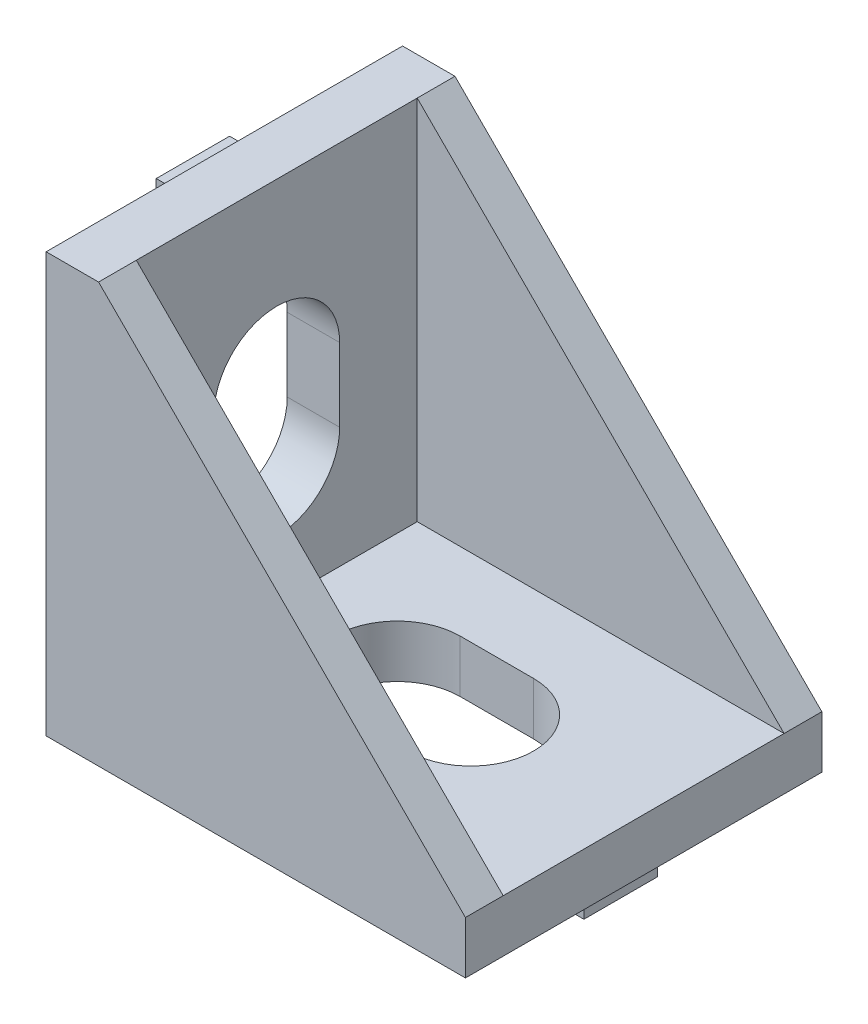
ISO-10303-21;
HEADER;
FILE_DESCRIPTION(('STEP AP214'),'2;1');
FILE_NAME('part.step','',(''),(''),'','','');
FILE_SCHEMA(('AUTOMOTIVE_DESIGN { 1 0 10303 214 1 1 1 1 }'));
ENDSEC;
DATA;
#1=APPLICATION_CONTEXT('core data for automotive mechanical design processes');
#2=APPLICATION_PROTOCOL_DEFINITION('international standard','automotive_design',2000,#1);
#3=PRODUCT_CONTEXT('',#1,'mechanical');
#4=PRODUCT('Part','Part','',(#3));
#5=PRODUCT_RELATED_PRODUCT_CATEGORY('part','',(#4));
#6=PRODUCT_DEFINITION_FORMATION('','',#4);
#7=PRODUCT_DEFINITION_CONTEXT('part definition',#1,'design');
#8=PRODUCT_DEFINITION('design','',#6,#7);
#9=PRODUCT_DEFINITION_SHAPE('','',#8);
#10=(LENGTH_UNIT() NAMED_UNIT(*) SI_UNIT(.MILLI.,.METRE.));
#11=(NAMED_UNIT(*) PLANE_ANGLE_UNIT() SI_UNIT($,.RADIAN.));
#12=(NAMED_UNIT(*) SI_UNIT($,.STERADIAN.) SOLID_ANGLE_UNIT());
#13=UNCERTAINTY_MEASURE_WITH_UNIT(LENGTH_MEASURE(1.E-05),#10,'distance_accuracy_value','');
#14=(GEOMETRIC_REPRESENTATION_CONTEXT(3) GLOBAL_UNCERTAINTY_ASSIGNED_CONTEXT((#13)) GLOBAL_UNIT_ASSIGNED_CONTEXT((#10,
#11,#12)) REPRESENTATION_CONTEXT('',''));
#15=CARTESIAN_POINT('',(0.,0.,0.));
#16=DIRECTION('',(0.,0.,1.));
#17=DIRECTION('',(1.,0.,0.));
#18=AXIS2_PLACEMENT_3D('',#15,#16,#17);
#19=CARTESIAN_POINT('',(0.,0.,8.5));
#20=DIRECTION('',(1.,0.,0.));
#21=DIRECTION('',(0.,0.,-1.));
#22=AXIS2_PLACEMENT_3D('',#19,#20,#21);
#23=PLANE('',#22);
#24=DIRECTION('',(0.,1.,0.));
#25=VECTOR('',#24,1.);
#26=CARTESIAN_POINT('',(0.,2.9,1.75));
#27=LINE('',#26,#25);
#28=CARTESIAN_POINT('',(0.,1.1,1.75));
#29=VERTEX_POINT('',#28);
#30=CARTESIAN_POINT('',(0.,2.9,1.75));
#31=VERTEX_POINT('',#30);
#32=EDGE_CURVE('E272',#29,#31,#27,.T.);
#33=ORIENTED_EDGE('',*,*,#32,.F.);
#34=DIRECTION('',(0.,0.,1.));
#35=VECTOR('',#34,1.);
#36=CARTESIAN_POINT('',(0.,1.1,-1.75));
#37=LINE('',#36,#35);
#38=CARTESIAN_POINT('',(0.,1.1,-1.75));
#39=VERTEX_POINT('',#38);
#40=EDGE_CURVE('E288',#39,#29,#37,.T.);
#41=ORIENTED_EDGE('',*,*,#40,.F.);
#42=DIRECTION('',(0.,-1.,0.));
#43=VECTOR('',#42,1.);
#44=CARTESIAN_POINT('',(0.,2.9,-1.75));
#45=LINE('',#44,#43);
#46=CARTESIAN_POINT('',(0.,2.9,-1.75));
#47=VERTEX_POINT('',#46);
#48=EDGE_CURVE('E301',#47,#39,#45,.T.);
#49=ORIENTED_EDGE('',*,*,#48,.F.);
#50=DIRECTION('',(0.,0.,-1.));
#51=VECTOR('',#50,1.);
#52=CARTESIAN_POINT('',(0.,2.9,-1.75));
#53=LINE('',#52,#51);
#54=EDGE_CURVE('E277',#31,#47,#53,.T.);
#55=ORIENTED_EDGE('',*,*,#54,.F.);
#56=EDGE_LOOP('',(#33,#41,#49,#55));
#57=FACE_BOUND('',#56,.T.);
#58=DIRECTION('',(0.,-1.,0.));
#59=VECTOR('',#58,1.);
#60=CARTESIAN_POINT('',(0.,0.,3.));
#61=LINE('',#60,#59);
#62=CARTESIAN_POINT('',(0.,11.75,3.));
#63=VERTEX_POINT('',#62);
#64=CARTESIAN_POINT('',(0.,8.25,3.));
#65=VERTEX_POINT('',#64);
#66=EDGE_CURVE('E449',#63,#65,#61,.T.);
#67=ORIENTED_EDGE('',*,*,#66,.T.);
#68=CARTESIAN_POINT('',(0.,8.25,0.));
#69=DIRECTION('',(1.,0.,0.));
#70=DIRECTION('',(0.,0.,-1.));
#71=AXIS2_PLACEMENT_3D('',#68,#69,#70);
#72=CIRCLE('',#71,3.);
#73=CARTESIAN_POINT('',(0.,8.25,-3.));
#74=VERTEX_POINT('',#73);
#75=EDGE_CURVE('E453',#65,#74,#72,.T.);
#76=ORIENTED_EDGE('',*,*,#75,.T.);
#77=DIRECTION('',(0.,1.,0.));
#78=VECTOR('',#77,1.);
#79=CARTESIAN_POINT('',(0.,0.,-3.));
#80=LINE('',#79,#78);
#81=CARTESIAN_POINT('',(0.,11.75,-3.));
#82=VERTEX_POINT('',#81);
#83=EDGE_CURVE('E432',#74,#82,#80,.T.);
#84=ORIENTED_EDGE('',*,*,#83,.T.);
#85=CARTESIAN_POINT('',(0.,11.75,0.));
#86=DIRECTION('',(1.,0.,0.));
#87=DIRECTION('',(0.,0.,-1.));
#88=AXIS2_PLACEMENT_3D('',#85,#86,#87);
#89=CIRCLE('',#88,3.);
#90=EDGE_CURVE('E445',#82,#63,#89,.T.);
#91=ORIENTED_EDGE('',*,*,#90,.T.);
#92=EDGE_LOOP('',(#67,#76,#84,#91));
#93=FACE_BOUND('',#92,.T.);
#94=DIRECTION('',(0.,-1.,0.));
#95=VECTOR('',#94,1.);
#96=CARTESIAN_POINT('',(0.,0.,-8.5));
#97=LINE('',#96,#95);
#98=CARTESIAN_POINT('',(0.,20.,-8.5));
#99=VERTEX_POINT('',#98);
#100=CARTESIAN_POINT('',(0.,0.,-8.5));
#101=VERTEX_POINT('',#100);
#102=EDGE_CURVE('E524',#99,#101,#97,.T.);
#103=ORIENTED_EDGE('',*,*,#102,.T.);
#104=DIRECTION('',(0.,0.,-1.));
#105=VECTOR('',#104,1.);
#106=CARTESIAN_POINT('',(0.,0.,8.5));
#107=LINE('',#106,#105);
#108=CARTESIAN_POINT('',(0.,0.,8.5));
#109=VERTEX_POINT('',#108);
#110=EDGE_CURVE('E578',#109,#101,#107,.T.);
#111=ORIENTED_EDGE('',*,*,#110,.F.);
#112=DIRECTION('',(0.,-1.,0.));
#113=VECTOR('',#112,1.);
#114=CARTESIAN_POINT('',(0.,0.,8.5));
#115=LINE('',#114,#113);
#116=CARTESIAN_POINT('',(0.,20.,8.5));
#117=VERTEX_POINT('',#116);
#118=EDGE_CURVE('E527',#117,#109,#115,.T.);
#119=ORIENTED_EDGE('',*,*,#118,.F.);
#120=DIRECTION('',(0.,0.,-1.));
#121=VECTOR('',#120,1.);
#122=CARTESIAN_POINT('',(0.,20.,8.5));
#123=LINE('',#122,#121);
#124=EDGE_CURVE('E544',#117,#99,#123,.T.);
#125=ORIENTED_EDGE('',*,*,#124,.T.);
#126=EDGE_LOOP('',(#103,#111,#119,#125));
#127=FACE_BOUND('',#126,.T.);
#128=DIRECTION('',(0.,-1.,0.));
#129=VECTOR('',#128,1.);
#130=CARTESIAN_POINT('',(0.,17.1,-1.75));
#131=LINE('',#130,#129);
#132=CARTESIAN_POINT('',(0.,18.9,-1.75));
#133=VERTEX_POINT('',#132);
#134=CARTESIAN_POINT('',(0.,17.1,-1.75));
#135=VERTEX_POINT('',#134);
#136=EDGE_CURVE('E270',#133,#135,#131,.T.);
#137=ORIENTED_EDGE('',*,*,#136,.F.);
#138=DIRECTION('',(0.,0.,-1.));
#139=VECTOR('',#138,1.);
#140=CARTESIAN_POINT('',(0.,18.9,-1.75));
#141=LINE('',#140,#139);
#142=CARTESIAN_POINT('',(0.,18.9,1.75));
#143=VERTEX_POINT('',#142);
#144=EDGE_CURVE('E267',#143,#133,#141,.T.);
#145=ORIENTED_EDGE('',*,*,#144,.F.);
#146=DIRECTION('',(0.,1.,0.));
#147=VECTOR('',#146,1.);
#148=CARTESIAN_POINT('',(0.,17.1,1.75));
#149=LINE('',#148,#147);
#150=CARTESIAN_POINT('',(0.,17.1,1.75));
#151=VERTEX_POINT('',#150);
#152=EDGE_CURVE('E59',#151,#143,#149,.T.);
#153=ORIENTED_EDGE('',*,*,#152,.F.);
#154=DIRECTION('',(0.,0.,1.));
#155=VECTOR('',#154,1.);
#156=CARTESIAN_POINT('',(0.,17.1,-1.75));
#157=LINE('',#156,#155);
#158=EDGE_CURVE('E54',#135,#151,#157,.T.);
#159=ORIENTED_EDGE('',*,*,#158,.F.);
#160=EDGE_LOOP('',(#137,#145,#153,#159));
#161=FACE_BOUND('',#160,.T.);
#162=ADVANCED_FACE('F39',(#57,#93,#127,#161),#23,.F.);
#163=CARTESIAN_POINT('',(0.,0.,8.5));
#164=DIRECTION('',(0.,1.,0.));
#165=DIRECTION('',(0.,0.,1.));
#166=AXIS2_PLACEMENT_3D('',#163,#164,#165);
#167=PLANE('',#166);
#168=DIRECTION('',(0.,0.,1.));
#169=VECTOR('',#168,1.);
#170=CARTESIAN_POINT('',(2.9,0.,1.75));
#171=LINE('',#170,#169);
#172=CARTESIAN_POINT('',(2.9,0.,-1.75));
#173=VERTEX_POINT('',#172);
#174=CARTESIAN_POINT('',(2.9,0.,1.75));
#175=VERTEX_POINT('',#174);
#176=EDGE_CURVE('E368',#173,#175,#171,.T.);
#177=ORIENTED_EDGE('',*,*,#176,.F.);
#178=DIRECTION('',(1.,0.,0.));
#179=VECTOR('',#178,1.);
#180=CARTESIAN_POINT('',(1.1,0.,-1.75));
#181=LINE('',#180,#179);
#182=CARTESIAN_POINT('',(1.1,0.,-1.75));
#183=VERTEX_POINT('',#182);
#184=EDGE_CURVE('E374',#183,#173,#181,.T.);
#185=ORIENTED_EDGE('',*,*,#184,.F.);
#186=DIRECTION('',(0.,0.,-1.));
#187=VECTOR('',#186,1.);
#188=CARTESIAN_POINT('',(1.1,0.,1.75));
#189=LINE('',#188,#187);
#190=CARTESIAN_POINT('',(1.1,0.,1.75));
#191=VERTEX_POINT('',#190);
#192=EDGE_CURVE('E391',#191,#183,#189,.T.);
#193=ORIENTED_EDGE('',*,*,#192,.F.);
#194=DIRECTION('',(-1.,0.,0.));
#195=VECTOR('',#194,1.);
#196=CARTESIAN_POINT('',(1.1,0.,1.75));
#197=LINE('',#196,#195);
#198=EDGE_CURVE('E387',#175,#191,#197,.T.);
#199=ORIENTED_EDGE('',*,*,#198,.F.);
#200=EDGE_LOOP('',(#177,#185,#193,#199));
#201=FACE_BOUND('',#200,.T.);
#202=DIRECTION('',(-1.,0.,0.));
#203=VECTOR('',#202,1.);
#204=CARTESIAN_POINT('',(0.,0.,-3.));
#205=LINE('',#204,#203);
#206=CARTESIAN_POINT('',(11.75,0.,-3.));
#207=VERTEX_POINT('',#206);
#208=CARTESIAN_POINT('',(8.25,0.,-3.));
#209=VERTEX_POINT('',#208);
#210=EDGE_CURVE('E493',#207,#209,#205,.T.);
#211=ORIENTED_EDGE('',*,*,#210,.T.);
#212=CARTESIAN_POINT('',(8.25,0.,0.));
#213=DIRECTION('',(0.,1.,0.));
#214=DIRECTION('',(0.,0.,1.));
#215=AXIS2_PLACEMENT_3D('',#212,#213,#214);
#216=CIRCLE('',#215,3.);
#217=CARTESIAN_POINT('',(8.25,0.,3.));
#218=VERTEX_POINT('',#217);
#219=EDGE_CURVE('E497',#209,#218,#216,.T.);
#220=ORIENTED_EDGE('',*,*,#219,.T.);
#221=DIRECTION('',(1.,0.,0.));
#222=VECTOR('',#221,1.);
#223=CARTESIAN_POINT('',(0.,0.,3.));
#224=LINE('',#223,#222);
#225=CARTESIAN_POINT('',(11.75,0.,3.));
#226=VERTEX_POINT('',#225);
#227=EDGE_CURVE('E476',#218,#226,#224,.T.);
#228=ORIENTED_EDGE('',*,*,#227,.T.);
#229=CARTESIAN_POINT('',(11.75,0.,0.));
#230=DIRECTION('',(0.,1.,0.));
#231=DIRECTION('',(0.,0.,1.));
#232=AXIS2_PLACEMENT_3D('',#229,#230,#231);
#233=CIRCLE('',#232,3.);
#234=EDGE_CURVE('E489',#226,#207,#233,.T.);
#235=ORIENTED_EDGE('',*,*,#234,.T.);
#236=EDGE_LOOP('',(#211,#220,#228,#235));
#237=FACE_BOUND('',#236,.T.);
#238=DIRECTION('',(1.,0.,0.));
#239=VECTOR('',#238,1.);
#240=CARTESIAN_POINT('',(0.,0.,-8.5));
#241=LINE('',#240,#239);
#242=CARTESIAN_POINT('',(20.,0.,-8.5));
#243=VERTEX_POINT('',#242);
#244=EDGE_CURVE('E548',#101,#243,#241,.T.);
#245=ORIENTED_EDGE('',*,*,#244,.T.);
#246=DIRECTION('',(0.,0.,-1.));
#247=VECTOR('',#246,1.);
#248=CARTESIAN_POINT('',(20.,0.,8.5));
#249=LINE('',#248,#247);
#250=CARTESIAN_POINT('',(20.,0.,8.5));
#251=VERTEX_POINT('',#250);
#252=EDGE_CURVE('E574',#251,#243,#249,.T.);
#253=ORIENTED_EDGE('',*,*,#252,.F.);
#254=DIRECTION('',(1.,0.,0.));
#255=VECTOR('',#254,1.);
#256=CARTESIAN_POINT('',(0.,0.,8.5));
#257=LINE('',#256,#255);
#258=EDGE_CURVE('E531',#109,#251,#257,.T.);
#259=ORIENTED_EDGE('',*,*,#258,.F.);
#260=ORIENTED_EDGE('',*,*,#110,.T.);
#261=EDGE_LOOP('',(#245,#253,#259,#260));
#262=FACE_BOUND('',#261,.T.);
#263=DIRECTION('',(0.,0.,1.));
#264=VECTOR('',#263,1.);
#265=CARTESIAN_POINT('',(18.9,0.,1.75));
#266=LINE('',#265,#264);
#267=CARTESIAN_POINT('',(18.9,0.,-1.75));
#268=VERTEX_POINT('',#267);
#269=CARTESIAN_POINT('',(18.9,0.,1.75));
#270=VERTEX_POINT('',#269);
#271=EDGE_CURVE('E323',#268,#270,#266,.T.);
#272=ORIENTED_EDGE('',*,*,#271,.F.);
#273=DIRECTION('',(1.,0.,0.));
#274=VECTOR('',#273,1.);
#275=CARTESIAN_POINT('',(18.9,0.,-1.75));
#276=LINE('',#275,#274);
#277=CARTESIAN_POINT('',(17.1,0.,-1.75));
#278=VERTEX_POINT('',#277);
#279=EDGE_CURVE('E329',#278,#268,#276,.T.);
#280=ORIENTED_EDGE('',*,*,#279,.F.);
#281=DIRECTION('',(0.,0.,-1.));
#282=VECTOR('',#281,1.);
#283=CARTESIAN_POINT('',(17.1,0.,1.75));
#284=LINE('',#283,#282);
#285=CARTESIAN_POINT('',(17.1,0.,1.75));
#286=VERTEX_POINT('',#285);
#287=EDGE_CURVE('E346',#286,#278,#284,.T.);
#288=ORIENTED_EDGE('',*,*,#287,.F.);
#289=DIRECTION('',(-1.,0.,0.));
#290=VECTOR('',#289,1.);
#291=CARTESIAN_POINT('',(18.9,0.,1.75));
#292=LINE('',#291,#290);
#293=EDGE_CURVE('E342',#270,#286,#292,.T.);
#294=ORIENTED_EDGE('',*,*,#293,.F.);
#295=EDGE_LOOP('',(#272,#280,#288,#294));
#296=FACE_BOUND('',#295,.T.);
#297=ADVANCED_FACE('F635',(#201,#237,#262,#296),#167,.F.);
#298=CARTESIAN_POINT('',(2.5,20.,8.5));
#299=DIRECTION('',(-0.707106781186547,-0.707106781186547,0.));
#300=DIRECTION('',(0.707106781186548,-0.707106781186548,0.));
#301=AXIS2_PLACEMENT_3D('',#298,#299,#300);
#302=PLANE('',#301);
#303=DIRECTION('',(0.707106781186548,-0.707106781186548,0.));
#304=VECTOR('',#303,1.);
#305=CARTESIAN_POINT('',(2.5,20.,6.7));
#306=LINE('',#305,#304);
#307=CARTESIAN_POINT('',(2.5,20.,6.7));
#308=VERTEX_POINT('',#307);
#309=CARTESIAN_POINT('',(20.,2.5,6.7));
#310=VERTEX_POINT('',#309);
#311=EDGE_CURVE('E47',#308,#310,#306,.T.);
#312=ORIENTED_EDGE('',*,*,#311,.F.);
#313=DIRECTION('',(0.,0.,-1.));
#314=VECTOR('',#313,1.);
#315=CARTESIAN_POINT('',(2.5,20.,8.5));
#316=LINE('',#315,#314);
#317=CARTESIAN_POINT('',(2.5,20.,8.5));
#318=VERTEX_POINT('',#317);
#319=EDGE_CURVE('E565',#318,#308,#316,.T.);
#320=ORIENTED_EDGE('',*,*,#319,.F.);
#321=DIRECTION('',(-0.707106781186548,0.707106781186548,0.));
#322=VECTOR('',#321,1.);
#323=CARTESIAN_POINT('',(2.5,20.,8.5));
#324=LINE('',#323,#322);
#325=CARTESIAN_POINT('',(20.,2.5,8.5));
#326=VERTEX_POINT('',#325);
#327=EDGE_CURVE('E538',#326,#318,#324,.T.);
#328=ORIENTED_EDGE('',*,*,#327,.F.);
#329=DIRECTION('',(0.,0.,-1.));
#330=VECTOR('',#329,1.);
#331=CARTESIAN_POINT('',(20.,2.5,8.5));
#332=LINE('',#331,#330);
#333=EDGE_CURVE('E570',#326,#310,#332,.T.);
#334=ORIENTED_EDGE('',*,*,#333,.T.);
#335=EDGE_LOOP('',(#312,#320,#328,#334));
#336=FACE_BOUND('',#335,.T.);
#337=ADVANCED_FACE('F600',(#336),#302,.F.);
#338=CARTESIAN_POINT('',(20.,2.5,8.5));
#339=DIRECTION('',(-1.,0.,0.));
#340=DIRECTION('',(0.,0.,1.));
#341=AXIS2_PLACEMENT_3D('',#338,#339,#340);
#342=PLANE('',#341);
#343=DIRECTION('',(0.,1.,0.));
#344=VECTOR('',#343,1.);
#345=CARTESIAN_POINT('',(20.,2.5,-8.5));
#346=LINE('',#345,#344);
#347=CARTESIAN_POINT('',(20.,2.5,-8.5));
#348=VERTEX_POINT('',#347);
#349=EDGE_CURVE('E551',#243,#348,#346,.T.);
#350=ORIENTED_EDGE('',*,*,#349,.T.);
#351=CARTESIAN_POINT('',(20.,2.5,-6.7));
#352=VERTEX_POINT('',#351);
#353=EDGE_CURVE('E569',#352,#348,#332,.T.);
#354=ORIENTED_EDGE('',*,*,#353,.F.);
#355=DIRECTION('',(0.,0.,-1.));
#356=VECTOR('',#355,1.);
#357=CARTESIAN_POINT('',(20.,2.5,6.7));
#358=LINE('',#357,#356);
#359=EDGE_CURVE('E511',#310,#352,#358,.T.);
#360=ORIENTED_EDGE('',*,*,#359,.F.);
#361=ORIENTED_EDGE('',*,*,#333,.F.);
#362=DIRECTION('',(0.,1.,0.));
#363=VECTOR('',#362,1.);
#364=CARTESIAN_POINT('',(20.,2.5,8.5));
#365=LINE('',#364,#363);
#366=EDGE_CURVE('E535',#251,#326,#365,.T.);
#367=ORIENTED_EDGE('',*,*,#366,.F.);
#368=ORIENTED_EDGE('',*,*,#252,.T.);
#369=EDGE_LOOP('',(#350,#354,#360,#361,#367,#368));
#370=FACE_BOUND('',#369,.T.);
#371=ADVANCED_FACE('F597',(#370),#342,.F.);
#372=CARTESIAN_POINT('',(2.5,20.,-6.7));
#373=VERTEX_POINT('',#372);
#374=CARTESIAN_POINT('',(2.5,20.,-8.5));
#375=VERTEX_POINT('',#374);
#376=EDGE_CURVE('E564',#373,#375,#316,.T.);
#377=ORIENTED_EDGE('',*,*,#376,.F.);
#378=DIRECTION('',(0.707106781186548,-0.707106781186548,0.));
#379=VECTOR('',#378,1.);
#380=CARTESIAN_POINT('',(2.5,20.,-6.7));
#381=LINE('',#380,#379);
#382=EDGE_CURVE('E11',#373,#352,#381,.T.);
#383=ORIENTED_EDGE('',*,*,#382,.T.);
#384=ORIENTED_EDGE('',*,*,#353,.T.);
#385=DIRECTION('',(-0.707106781186548,0.707106781186548,0.));
#386=VECTOR('',#385,1.);
#387=CARTESIAN_POINT('',(2.5,20.,-8.5));
#388=LINE('',#387,#386);
#389=EDGE_CURVE('E555',#348,#375,#388,.T.);
#390=ORIENTED_EDGE('',*,*,#389,.T.);
#391=EDGE_LOOP('',(#377,#383,#384,#390));
#392=FACE_BOUND('',#391,.T.);
#393=ADVANCED_FACE('F615',(#392),#302,.F.);
#394=CARTESIAN_POINT('',(0.,20.,8.5));
#395=DIRECTION('',(0.,-1.,0.));
#396=DIRECTION('',(0.,0.,-1.));
#397=AXIS2_PLACEMENT_3D('',#394,#395,#396);
#398=PLANE('',#397);
#399=DIRECTION('',(-1.,0.,0.));
#400=VECTOR('',#399,1.);
#401=CARTESIAN_POINT('',(0.,20.,-8.5));
#402=LINE('',#401,#400);
#403=EDGE_CURVE('E532',#375,#99,#402,.T.);
#404=ORIENTED_EDGE('',*,*,#403,.T.);
#405=ORIENTED_EDGE('',*,*,#124,.F.);
#406=DIRECTION('',(-1.,0.,0.));
#407=VECTOR('',#406,1.);
#408=CARTESIAN_POINT('',(0.,20.,8.5));
#409=LINE('',#408,#407);
#410=EDGE_CURVE('E541',#318,#117,#409,.T.);
#411=ORIENTED_EDGE('',*,*,#410,.F.);
#412=ORIENTED_EDGE('',*,*,#319,.T.);
#413=DIRECTION('',(0.,0.,-1.));
#414=VECTOR('',#413,1.);
#415=CARTESIAN_POINT('',(2.5,20.,6.7));
#416=LINE('',#415,#414);
#417=EDGE_CURVE('E502',#308,#373,#416,.T.);
#418=ORIENTED_EDGE('',*,*,#417,.T.);
#419=ORIENTED_EDGE('',*,*,#376,.T.);
#420=EDGE_LOOP('',(#404,#405,#411,#412,#418,#419));
#421=FACE_BOUND('',#420,.T.);
#422=ADVANCED_FACE('F620',(#421),#398,.F.);
#423=CARTESIAN_POINT('',(0.,0.,8.5));
#424=DIRECTION('',(0.,0.,-1.));
#425=DIRECTION('',(-1.,0.,0.));
#426=AXIS2_PLACEMENT_3D('',#423,#424,#425);
#427=PLANE('',#426);
#428=ORIENTED_EDGE('',*,*,#118,.T.);
#429=ORIENTED_EDGE('',*,*,#258,.T.);
#430=ORIENTED_EDGE('',*,*,#366,.T.);
#431=ORIENTED_EDGE('',*,*,#327,.T.);
#432=ORIENTED_EDGE('',*,*,#410,.T.);
#433=EDGE_LOOP('',(#428,#429,#430,#431,#432));
#434=FACE_BOUND('',#433,.T.);
#435=ADVANCED_FACE('F603',(#434),#427,.F.);
#436=CARTESIAN_POINT('',(0.,0.,-8.5));
#437=DIRECTION('',(0.,0.,-1.));
#438=DIRECTION('',(-1.,0.,0.));
#439=AXIS2_PLACEMENT_3D('',#436,#437,#438);
#440=PLANE('',#439);
#441=ORIENTED_EDGE('',*,*,#102,.F.);
#442=ORIENTED_EDGE('',*,*,#403,.F.);
#443=ORIENTED_EDGE('',*,*,#389,.F.);
#444=ORIENTED_EDGE('',*,*,#349,.F.);
#445=ORIENTED_EDGE('',*,*,#244,.F.);
#446=EDGE_LOOP('',(#441,#442,#443,#444,#445));
#447=FACE_BOUND('',#446,.T.);
#448=ADVANCED_FACE('F611',(#447),#440,.T.);
#449=CARTESIAN_POINT('',(2.5,20.,-6.7));
#450=DIRECTION('',(0.,0.,-1.));
#451=DIRECTION('',(-1.,0.,0.));
#452=AXIS2_PLACEMENT_3D('',#449,#450,#451);
#453=PLANE('',#452);
#454=DIRECTION('',(0.,-1.,0.));
#455=VECTOR('',#454,1.);
#456=CARTESIAN_POINT('',(2.5,20.,-6.7));
#457=LINE('',#456,#455);
#458=CARTESIAN_POINT('',(2.5,2.5,-6.7));
#459=VERTEX_POINT('',#458);
#460=EDGE_CURVE('E521',#373,#459,#457,.T.);
#461=ORIENTED_EDGE('',*,*,#460,.T.);
#462=DIRECTION('',(1.,0.,0.));
#463=VECTOR('',#462,1.);
#464=CARTESIAN_POINT('',(2.5,2.5,-6.7));
#465=LINE('',#464,#463);
#466=EDGE_CURVE('E501',#459,#352,#465,.T.);
#467=ORIENTED_EDGE('',*,*,#466,.T.);
#468=ORIENTED_EDGE('',*,*,#382,.F.);
#469=EDGE_LOOP('',(#461,#467,#468));
#470=FACE_BOUND('',#469,.T.);
#471=ADVANCED_FACE('F624',(#470),#453,.F.);
#472=CARTESIAN_POINT('',(2.5,20.,6.7));
#473=DIRECTION('',(0.,0.,-1.));
#474=DIRECTION('',(-1.,0.,0.));
#475=AXIS2_PLACEMENT_3D('',#472,#473,#474);
#476=PLANE('',#475);
#477=ORIENTED_EDGE('',*,*,#311,.T.);
#478=DIRECTION('',(1.,0.,0.));
#479=VECTOR('',#478,1.);
#480=CARTESIAN_POINT('',(2.5,2.5,6.7));
#481=LINE('',#480,#479);
#482=CARTESIAN_POINT('',(2.5,2.5,6.7));
#483=VERTEX_POINT('',#482);
#484=EDGE_CURVE('E514',#483,#310,#481,.T.);
#485=ORIENTED_EDGE('',*,*,#484,.F.);
#486=DIRECTION('',(0.,-1.,0.));
#487=VECTOR('',#486,1.);
#488=CARTESIAN_POINT('',(2.5,20.,6.7));
#489=LINE('',#488,#487);
#490=EDGE_CURVE('E506',#308,#483,#489,.T.);
#491=ORIENTED_EDGE('',*,*,#490,.F.);
#492=EDGE_LOOP('',(#477,#485,#491));
#493=FACE_BOUND('',#492,.T.);
#494=ADVANCED_FACE('F585',(#493),#476,.T.);
#495=CARTESIAN_POINT('',(2.5,20.,6.7));
#496=DIRECTION('',(-1.,0.,0.));
#497=DIRECTION('',(0.,0.,1.));
#498=AXIS2_PLACEMENT_3D('',#495,#496,#497);
#499=PLANE('',#498);
#500=DIRECTION('',(0.,1.,0.));
#501=VECTOR('',#500,1.);
#502=CARTESIAN_POINT('',(2.5,8.25,-3.));
#503=LINE('',#502,#501);
#504=CARTESIAN_POINT('',(2.5,8.25,-3.));
#505=VERTEX_POINT('',#504);
#506=CARTESIAN_POINT('',(2.5,11.75,-3.));
#507=VERTEX_POINT('',#506);
#508=EDGE_CURVE('E416',#505,#507,#503,.T.);
#509=ORIENTED_EDGE('',*,*,#508,.F.);
#510=CARTESIAN_POINT('',(2.5,8.25,0.));
#511=DIRECTION('',(1.,0.,0.));
#512=DIRECTION('',(0.,0.,-1.));
#513=AXIS2_PLACEMENT_3D('',#510,#511,#512);
#514=CIRCLE('',#513,3.);
#515=CARTESIAN_POINT('',(2.5,8.25,3.));
#516=VERTEX_POINT('',#515);
#517=EDGE_CURVE('E413',#516,#505,#514,.T.);
#518=ORIENTED_EDGE('',*,*,#517,.F.);
#519=DIRECTION('',(0.,-1.,0.));
#520=VECTOR('',#519,1.);
#521=CARTESIAN_POINT('',(2.5,8.25,3.));
#522=LINE('',#521,#520);
#523=CARTESIAN_POINT('',(2.5,11.75,3.));
#524=VERTEX_POINT('',#523);
#525=EDGE_CURVE('E424',#524,#516,#522,.T.);
#526=ORIENTED_EDGE('',*,*,#525,.F.);
#527=CARTESIAN_POINT('',(2.5,11.75,0.));
#528=DIRECTION('',(1.,0.,0.));
#529=DIRECTION('',(0.,0.,-1.));
#530=AXIS2_PLACEMENT_3D('',#527,#528,#529);
#531=CIRCLE('',#530,3.);
#532=EDGE_CURVE('E420',#507,#524,#531,.T.);
#533=ORIENTED_EDGE('',*,*,#532,.F.);
#534=EDGE_LOOP('',(#509,#518,#526,#533));
#535=FACE_BOUND('',#534,.T.);
#536=DIRECTION('',(0.,0.,-1.));
#537=VECTOR('',#536,1.);
#538=CARTESIAN_POINT('',(2.5,2.5,6.7));
#539=LINE('',#538,#537);
#540=EDGE_CURVE('E507',#483,#459,#539,.T.);
#541=ORIENTED_EDGE('',*,*,#540,.T.);
#542=ORIENTED_EDGE('',*,*,#460,.F.);
#543=ORIENTED_EDGE('',*,*,#417,.F.);
#544=ORIENTED_EDGE('',*,*,#490,.T.);
#545=EDGE_LOOP('',(#541,#542,#543,#544));
#546=FACE_BOUND('',#545,.T.);
#547=ADVANCED_FACE('F622',(#535,#546),#499,.F.);
#548=CARTESIAN_POINT('',(0.,2.5,0.));
#549=DIRECTION('',(0.,1.,0.));
#550=DIRECTION('',(0.,0.,1.));
#551=AXIS2_PLACEMENT_3D('',#548,#549,#550);
#552=PLANE('',#551);
#553=CARTESIAN_POINT('',(8.25,2.5,0.));
#554=DIRECTION('',(0.,1.,0.));
#555=DIRECTION('',(0.,0.,1.));
#556=AXIS2_PLACEMENT_3D('',#553,#554,#555);
#557=CIRCLE('',#556,3.);
#558=CARTESIAN_POINT('',(8.25,2.5,-3.));
#559=VERTEX_POINT('',#558);
#560=CARTESIAN_POINT('',(8.25,2.5,3.));
#561=VERTEX_POINT('',#560);
#562=EDGE_CURVE('E457',#559,#561,#557,.T.);
#563=ORIENTED_EDGE('',*,*,#562,.F.);
#564=DIRECTION('',(-1.,0.,0.));
#565=VECTOR('',#564,1.);
#566=CARTESIAN_POINT('',(8.25,2.5,-3.));
#567=LINE('',#566,#565);
#568=CARTESIAN_POINT('',(11.75,2.5,-3.));
#569=VERTEX_POINT('',#568);
#570=EDGE_CURVE('E468',#569,#559,#567,.T.);
#571=ORIENTED_EDGE('',*,*,#570,.F.);
#572=CARTESIAN_POINT('',(11.75,2.5,0.));
#573=DIRECTION('',(0.,1.,0.));
#574=DIRECTION('',(0.,0.,1.));
#575=AXIS2_PLACEMENT_3D('',#572,#573,#574);
#576=CIRCLE('',#575,3.);
#577=CARTESIAN_POINT('',(11.75,2.5,3.));
#578=VERTEX_POINT('',#577);
#579=EDGE_CURVE('E464',#578,#569,#576,.T.);
#580=ORIENTED_EDGE('',*,*,#579,.F.);
#581=DIRECTION('',(1.,0.,0.));
#582=VECTOR('',#581,1.);
#583=CARTESIAN_POINT('',(8.25,2.5,3.));
#584=LINE('',#583,#582);
#585=EDGE_CURVE('E460',#561,#578,#584,.T.);
#586=ORIENTED_EDGE('',*,*,#585,.F.);
#587=EDGE_LOOP('',(#563,#571,#580,#586));
#588=FACE_BOUND('',#587,.T.);
#589=ORIENTED_EDGE('',*,*,#466,.F.);
#590=ORIENTED_EDGE('',*,*,#540,.F.);
#591=ORIENTED_EDGE('',*,*,#484,.T.);
#592=ORIENTED_EDGE('',*,*,#359,.T.);
#593=EDGE_LOOP('',(#589,#590,#591,#592));
#594=FACE_BOUND('',#593,.T.);
#595=ADVANCED_FACE('F593',(#588,#594),#552,.T.);
#596=CARTESIAN_POINT('',(8.25,-14.5,0.));
#597=DIRECTION('',(0.,1.,0.));
#598=DIRECTION('',(0.,0.,1.));
#599=AXIS2_PLACEMENT_3D('',#596,#597,#598);
#600=CYLINDRICAL_SURFACE('',#599,3.);
#601=DIRECTION('',(0.,1.,0.));
#602=VECTOR('',#601,1.);
#603=CARTESIAN_POINT('',(8.25,-14.5,-3.));
#604=LINE('',#603,#602);
#605=EDGE_CURVE('E473',#209,#559,#604,.T.);
#606=ORIENTED_EDGE('',*,*,#605,.T.);
#607=ORIENTED_EDGE('',*,*,#562,.T.);
#608=DIRECTION('',(0.,1.,0.));
#609=VECTOR('',#608,1.);
#610=CARTESIAN_POINT('',(8.25,-14.5,3.));
#611=LINE('',#610,#609);
#612=EDGE_CURVE('E472',#218,#561,#611,.T.);
#613=ORIENTED_EDGE('',*,*,#612,.F.);
#614=ORIENTED_EDGE('',*,*,#219,.F.);
#615=EDGE_LOOP('',(#606,#607,#613,#614));
#616=FACE_BOUND('',#615,.T.);
#617=ADVANCED_FACE('F760',(#616),#600,.F.);
#618=CARTESIAN_POINT('',(8.25,-14.5,-3.));
#619=DIRECTION('',(0.,0.,-1.));
#620=DIRECTION('',(-1.,0.,0.));
#621=AXIS2_PLACEMENT_3D('',#618,#619,#620);
#622=PLANE('',#621);
#623=DIRECTION('',(0.,1.,0.));
#624=VECTOR('',#623,1.);
#625=CARTESIAN_POINT('',(11.75,-14.5,-3.));
#626=LINE('',#625,#624);
#627=EDGE_CURVE('E477',#207,#569,#626,.T.);
#628=ORIENTED_EDGE('',*,*,#627,.T.);
#629=ORIENTED_EDGE('',*,*,#570,.T.);
#630=ORIENTED_EDGE('',*,*,#605,.F.);
#631=ORIENTED_EDGE('',*,*,#210,.F.);
#632=EDGE_LOOP('',(#628,#629,#630,#631));
#633=FACE_BOUND('',#632,.T.);
#634=ADVANCED_FACE('F756',(#633),#622,.F.);
#635=CARTESIAN_POINT('',(11.75,-14.5,0.));
#636=DIRECTION('',(0.,1.,0.));
#637=DIRECTION('',(0.,0.,1.));
#638=AXIS2_PLACEMENT_3D('',#635,#636,#637);
#639=CYLINDRICAL_SURFACE('',#638,3.);
#640=DIRECTION('',(0.,1.,0.));
#641=VECTOR('',#640,1.);
#642=CARTESIAN_POINT('',(11.75,-14.5,3.));
#643=LINE('',#642,#641);
#644=EDGE_CURVE('E480',#226,#578,#643,.T.);
#645=ORIENTED_EDGE('',*,*,#644,.T.);
#646=ORIENTED_EDGE('',*,*,#579,.T.);
#647=ORIENTED_EDGE('',*,*,#627,.F.);
#648=ORIENTED_EDGE('',*,*,#234,.F.);
#649=EDGE_LOOP('',(#645,#646,#647,#648));
#650=FACE_BOUND('',#649,.T.);
#651=ADVANCED_FACE('F759',(#650),#639,.F.);
#652=CARTESIAN_POINT('',(8.25,-14.5,3.));
#653=DIRECTION('',(0.,0.,1.));
#654=DIRECTION('',(1.,0.,0.));
#655=AXIS2_PLACEMENT_3D('',#652,#653,#654);
#656=PLANE('',#655);
#657=ORIENTED_EDGE('',*,*,#612,.T.);
#658=ORIENTED_EDGE('',*,*,#585,.T.);
#659=ORIENTED_EDGE('',*,*,#644,.F.);
#660=ORIENTED_EDGE('',*,*,#227,.F.);
#661=EDGE_LOOP('',(#657,#658,#659,#660));
#662=FACE_BOUND('',#661,.T.);
#663=ADVANCED_FACE('F754',(#662),#656,.F.);
#664=CARTESIAN_POINT('',(-14.5,8.25,0.));
#665=DIRECTION('',(1.,0.,0.));
#666=DIRECTION('',(0.,0.,-1.));
#667=AXIS2_PLACEMENT_3D('',#664,#665,#666);
#668=CYLINDRICAL_SURFACE('',#667,3.);
#669=DIRECTION('',(1.,0.,0.));
#670=VECTOR('',#669,1.);
#671=CARTESIAN_POINT('',(-14.5,8.25,3.));
#672=LINE('',#671,#670);
#673=EDGE_CURVE('E429',#65,#516,#672,.T.);
#674=ORIENTED_EDGE('',*,*,#673,.T.);
#675=ORIENTED_EDGE('',*,*,#517,.T.);
#676=DIRECTION('',(1.,0.,0.));
#677=VECTOR('',#676,1.);
#678=CARTESIAN_POINT('',(-14.5,8.25,-3.));
#679=LINE('',#678,#677);
#680=EDGE_CURVE('E428',#74,#505,#679,.T.);
#681=ORIENTED_EDGE('',*,*,#680,.F.);
#682=ORIENTED_EDGE('',*,*,#75,.F.);
#683=EDGE_LOOP('',(#674,#675,#681,#682));
#684=FACE_BOUND('',#683,.T.);
#685=ADVANCED_FACE('F744',(#684),#668,.F.);
#686=CARTESIAN_POINT('',(-14.5,8.25,3.));
#687=DIRECTION('',(0.,0.,1.));
#688=DIRECTION('',(1.,0.,0.));
#689=AXIS2_PLACEMENT_3D('',#686,#687,#688);
#690=PLANE('',#689);
#691=DIRECTION('',(1.,0.,0.));
#692=VECTOR('',#691,1.);
#693=CARTESIAN_POINT('',(-14.5,11.75,3.));
#694=LINE('',#693,#692);
#695=EDGE_CURVE('E433',#63,#524,#694,.T.);
#696=ORIENTED_EDGE('',*,*,#695,.T.);
#697=ORIENTED_EDGE('',*,*,#525,.T.);
#698=ORIENTED_EDGE('',*,*,#673,.F.);
#699=ORIENTED_EDGE('',*,*,#66,.F.);
#700=EDGE_LOOP('',(#696,#697,#698,#699));
#701=FACE_BOUND('',#700,.T.);
#702=ADVANCED_FACE('F740',(#701),#690,.F.);
#703=CARTESIAN_POINT('',(-14.5,11.75,0.));
#704=DIRECTION('',(1.,0.,0.));
#705=DIRECTION('',(0.,0.,-1.));
#706=AXIS2_PLACEMENT_3D('',#703,#704,#705);
#707=CYLINDRICAL_SURFACE('',#706,3.);
#708=DIRECTION('',(1.,0.,0.));
#709=VECTOR('',#708,1.);
#710=CARTESIAN_POINT('',(-14.5,11.75,-3.));
#711=LINE('',#710,#709);
#712=EDGE_CURVE('E436',#82,#507,#711,.T.);
#713=ORIENTED_EDGE('',*,*,#712,.T.);
#714=ORIENTED_EDGE('',*,*,#532,.T.);
#715=ORIENTED_EDGE('',*,*,#695,.F.);
#716=ORIENTED_EDGE('',*,*,#90,.F.);
#717=EDGE_LOOP('',(#713,#714,#715,#716));
#718=FACE_BOUND('',#717,.T.);
#719=ADVANCED_FACE('F743',(#718),#707,.F.);
#720=CARTESIAN_POINT('',(-14.5,8.25,-3.));
#721=DIRECTION('',(0.,0.,-1.));
#722=DIRECTION('',(-1.,0.,0.));
#723=AXIS2_PLACEMENT_3D('',#720,#721,#722);
#724=PLANE('',#723);
#725=ORIENTED_EDGE('',*,*,#680,.T.);
#726=ORIENTED_EDGE('',*,*,#508,.T.);
#727=ORIENTED_EDGE('',*,*,#712,.F.);
#728=ORIENTED_EDGE('',*,*,#83,.F.);
#729=EDGE_LOOP('',(#725,#726,#727,#728));
#730=FACE_BOUND('',#729,.T.);
#731=ADVANCED_FACE('F738',(#730),#724,.F.);
#732=CARTESIAN_POINT('',(2.9,-1.5,1.75));
#733=DIRECTION('',(-1.,0.,0.));
#734=DIRECTION('',(0.,0.,1.));
#735=AXIS2_PLACEMENT_3D('',#732,#733,#734);
#736=PLANE('',#735);
#737=ORIENTED_EDGE('',*,*,#176,.T.);
#738=DIRECTION('',(0.,1.,0.));
#739=VECTOR('',#738,1.);
#740=CARTESIAN_POINT('',(2.9,-1.5,1.75));
#741=LINE('',#740,#739);
#742=CARTESIAN_POINT('',(2.9,-1.5,1.75));
#743=VERTEX_POINT('',#742);
#744=EDGE_CURVE('E409',#743,#175,#741,.T.);
#745=ORIENTED_EDGE('',*,*,#744,.F.);
#746=DIRECTION('',(0.,0.,1.));
#747=VECTOR('',#746,1.);
#748=CARTESIAN_POINT('',(2.9,-1.5,1.75));
#749=LINE('',#748,#747);
#750=CARTESIAN_POINT('',(2.9,-1.5,-1.75));
#751=VERTEX_POINT('',#750);
#752=EDGE_CURVE('E369',#751,#743,#749,.T.);
#753=ORIENTED_EDGE('',*,*,#752,.F.);
#754=DIRECTION('',(0.,1.,0.));
#755=VECTOR('',#754,1.);
#756=CARTESIAN_POINT('',(2.9,-1.5,-1.75));
#757=LINE('',#756,#755);
#758=EDGE_CURVE('E383',#751,#173,#757,.T.);
#759=ORIENTED_EDGE('',*,*,#758,.T.);
#760=EDGE_LOOP('',(#737,#745,#753,#759));
#761=FACE_BOUND('',#760,.T.);
#762=ADVANCED_FACE('F734',(#761),#736,.F.);
#763=CARTESIAN_POINT('',(1.1,-1.5,1.75));
#764=DIRECTION('',(0.,0.,-1.));
#765=DIRECTION('',(-1.,0.,0.));
#766=AXIS2_PLACEMENT_3D('',#763,#764,#765);
#767=PLANE('',#766);
#768=ORIENTED_EDGE('',*,*,#198,.T.);
#769=DIRECTION('',(0.,1.,0.));
#770=VECTOR('',#769,1.);
#771=CARTESIAN_POINT('',(1.1,-1.5,1.75));
#772=LINE('',#771,#770);
#773=CARTESIAN_POINT('',(1.1,-1.5,1.75));
#774=VERTEX_POINT('',#773);
#775=EDGE_CURVE('E405',#774,#191,#772,.T.);
#776=ORIENTED_EDGE('',*,*,#775,.F.);
#777=DIRECTION('',(-1.,0.,0.));
#778=VECTOR('',#777,1.);
#779=CARTESIAN_POINT('',(1.1,-1.5,1.75));
#780=LINE('',#779,#778);
#781=EDGE_CURVE('E373',#743,#774,#780,.T.);
#782=ORIENTED_EDGE('',*,*,#781,.F.);
#783=ORIENTED_EDGE('',*,*,#744,.T.);
#784=EDGE_LOOP('',(#768,#776,#782,#783));
#785=FACE_BOUND('',#784,.T.);
#786=ADVANCED_FACE('F730',(#785),#767,.F.);
#787=CARTESIAN_POINT('',(1.1,-1.5,1.75));
#788=DIRECTION('',(1.,0.,0.));
#789=DIRECTION('',(0.,0.,-1.));
#790=AXIS2_PLACEMENT_3D('',#787,#788,#789);
#791=PLANE('',#790);
#792=ORIENTED_EDGE('',*,*,#192,.T.);
#793=DIRECTION('',(0.,1.,0.));
#794=VECTOR('',#793,1.);
#795=CARTESIAN_POINT('',(1.1,-1.5,-1.75));
#796=LINE('',#795,#794);
#797=CARTESIAN_POINT('',(1.1,-1.5,-1.75));
#798=VERTEX_POINT('',#797);
#799=EDGE_CURVE('E401',#798,#183,#796,.T.);
#800=ORIENTED_EDGE('',*,*,#799,.F.);
#801=DIRECTION('',(0.,0.,-1.));
#802=VECTOR('',#801,1.);
#803=CARTESIAN_POINT('',(1.1,-1.5,1.75));
#804=LINE('',#803,#802);
#805=EDGE_CURVE('E377',#774,#798,#804,.T.);
#806=ORIENTED_EDGE('',*,*,#805,.F.);
#807=ORIENTED_EDGE('',*,*,#775,.T.);
#808=EDGE_LOOP('',(#792,#800,#806,#807));
#809=FACE_BOUND('',#808,.T.);
#810=ADVANCED_FACE('F726',(#809),#791,.F.);
#811=CARTESIAN_POINT('',(1.1,-1.5,-1.75));
#812=DIRECTION('',(0.,0.,1.));
#813=DIRECTION('',(1.,0.,0.));
#814=AXIS2_PLACEMENT_3D('',#811,#812,#813);
#815=PLANE('',#814);
#816=ORIENTED_EDGE('',*,*,#184,.T.);
#817=ORIENTED_EDGE('',*,*,#758,.F.);
#818=DIRECTION('',(1.,0.,0.));
#819=VECTOR('',#818,1.);
#820=CARTESIAN_POINT('',(1.1,-1.5,-1.75));
#821=LINE('',#820,#819);
#822=EDGE_CURVE('E380',#798,#751,#821,.T.);
#823=ORIENTED_EDGE('',*,*,#822,.F.);
#824=ORIENTED_EDGE('',*,*,#799,.T.);
#825=EDGE_LOOP('',(#816,#817,#823,#824));
#826=FACE_BOUND('',#825,.T.);
#827=ADVANCED_FACE('F722',(#826),#815,.F.);
#828=CARTESIAN_POINT('',(0.,-1.5,0.));
#829=DIRECTION('',(0.,-1.,0.));
#830=DIRECTION('',(0.,0.,-1.));
#831=AXIS2_PLACEMENT_3D('',#828,#829,#830);
#832=PLANE('',#831);
#833=ORIENTED_EDGE('',*,*,#752,.T.);
#834=ORIENTED_EDGE('',*,*,#781,.T.);
#835=ORIENTED_EDGE('',*,*,#805,.T.);
#836=ORIENTED_EDGE('',*,*,#822,.T.);
#837=EDGE_LOOP('',(#833,#834,#835,#836));
#838=FACE_BOUND('',#837,.T.);
#839=ADVANCED_FACE('F718',(#838),#832,.T.);
#840=CARTESIAN_POINT('',(18.9,-1.5,1.75));
#841=DIRECTION('',(-1.,0.,0.));
#842=DIRECTION('',(0.,0.,1.));
#843=AXIS2_PLACEMENT_3D('',#840,#841,#842);
#844=PLANE('',#843);
#845=ORIENTED_EDGE('',*,*,#271,.T.);
#846=DIRECTION('',(0.,1.,0.));
#847=VECTOR('',#846,1.);
#848=CARTESIAN_POINT('',(18.9,-1.5,1.75));
#849=LINE('',#848,#847);
#850=CARTESIAN_POINT('',(18.9,-1.5,1.75));
#851=VERTEX_POINT('',#850);
#852=EDGE_CURVE('E364',#851,#270,#849,.T.);
#853=ORIENTED_EDGE('',*,*,#852,.F.);
#854=DIRECTION('',(0.,0.,1.));
#855=VECTOR('',#854,1.);
#856=CARTESIAN_POINT('',(18.9,-1.5,1.75));
#857=LINE('',#856,#855);
#858=CARTESIAN_POINT('',(18.9,-1.5,-1.75));
#859=VERTEX_POINT('',#858);
#860=EDGE_CURVE('E324',#859,#851,#857,.T.);
#861=ORIENTED_EDGE('',*,*,#860,.F.);
#862=DIRECTION('',(0.,1.,0.));
#863=VECTOR('',#862,1.);
#864=CARTESIAN_POINT('',(18.9,-1.5,-1.75));
#865=LINE('',#864,#863);
#866=EDGE_CURVE('E338',#859,#268,#865,.T.);
#867=ORIENTED_EDGE('',*,*,#866,.T.);
#868=EDGE_LOOP('',(#845,#853,#861,#867));
#869=FACE_BOUND('',#868,.T.);
#870=ADVANCED_FACE('F714',(#869),#844,.F.);
#871=CARTESIAN_POINT('',(18.9,-1.5,1.75));
#872=DIRECTION('',(0.,0.,-1.));
#873=DIRECTION('',(-1.,0.,0.));
#874=AXIS2_PLACEMENT_3D('',#871,#872,#873);
#875=PLANE('',#874);
#876=ORIENTED_EDGE('',*,*,#293,.T.);
#877=DIRECTION('',(0.,1.,0.));
#878=VECTOR('',#877,1.);
#879=CARTESIAN_POINT('',(17.1,-1.5,1.75));
#880=LINE('',#879,#878);
#881=CARTESIAN_POINT('',(17.1,-1.5,1.75));
#882=VERTEX_POINT('',#881);
#883=EDGE_CURVE('E360',#882,#286,#880,.T.);
#884=ORIENTED_EDGE('',*,*,#883,.F.);
#885=DIRECTION('',(-1.,0.,0.));
#886=VECTOR('',#885,1.);
#887=CARTESIAN_POINT('',(18.9,-1.5,1.75));
#888=LINE('',#887,#886);
#889=EDGE_CURVE('E328',#851,#882,#888,.T.);
#890=ORIENTED_EDGE('',*,*,#889,.F.);
#891=ORIENTED_EDGE('',*,*,#852,.T.);
#892=EDGE_LOOP('',(#876,#884,#890,#891));
#893=FACE_BOUND('',#892,.T.);
#894=ADVANCED_FACE('F710',(#893),#875,.F.);
#895=CARTESIAN_POINT('',(17.1,-1.5,1.75));
#896=DIRECTION('',(1.,0.,0.));
#897=DIRECTION('',(0.,0.,-1.));
#898=AXIS2_PLACEMENT_3D('',#895,#896,#897);
#899=PLANE('',#898);
#900=ORIENTED_EDGE('',*,*,#287,.T.);
#901=DIRECTION('',(0.,1.,0.));
#902=VECTOR('',#901,1.);
#903=CARTESIAN_POINT('',(17.1,-1.5,-1.75));
#904=LINE('',#903,#902);
#905=CARTESIAN_POINT('',(17.1,-1.5,-1.75));
#906=VERTEX_POINT('',#905);
#907=EDGE_CURVE('E356',#906,#278,#904,.T.);
#908=ORIENTED_EDGE('',*,*,#907,.F.);
#909=DIRECTION('',(0.,0.,-1.));
#910=VECTOR('',#909,1.);
#911=CARTESIAN_POINT('',(17.1,-1.5,1.75));
#912=LINE('',#911,#910);
#913=EDGE_CURVE('E332',#882,#906,#912,.T.);
#914=ORIENTED_EDGE('',*,*,#913,.F.);
#915=ORIENTED_EDGE('',*,*,#883,.T.);
#916=EDGE_LOOP('',(#900,#908,#914,#915));
#917=FACE_BOUND('',#916,.T.);
#918=ADVANCED_FACE('F706',(#917),#899,.F.);
#919=CARTESIAN_POINT('',(18.9,-1.5,-1.75));
#920=DIRECTION('',(0.,0.,1.));
#921=DIRECTION('',(1.,0.,0.));
#922=AXIS2_PLACEMENT_3D('',#919,#920,#921);
#923=PLANE('',#922);
#924=ORIENTED_EDGE('',*,*,#279,.T.);
#925=ORIENTED_EDGE('',*,*,#866,.F.);
#926=DIRECTION('',(1.,0.,0.));
#927=VECTOR('',#926,1.);
#928=CARTESIAN_POINT('',(18.9,-1.5,-1.75));
#929=LINE('',#928,#927);
#930=EDGE_CURVE('E335',#906,#859,#929,.T.);
#931=ORIENTED_EDGE('',*,*,#930,.F.);
#932=ORIENTED_EDGE('',*,*,#907,.T.);
#933=EDGE_LOOP('',(#924,#925,#931,#932));
#934=FACE_BOUND('',#933,.T.);
#935=ADVANCED_FACE('F702',(#934),#923,.F.);
#936=CARTESIAN_POINT('',(0.,-1.5,0.));
#937=DIRECTION('',(0.,1.,0.));
#938=DIRECTION('',(0.,0.,1.));
#939=AXIS2_PLACEMENT_3D('',#936,#937,#938);
#940=PLANE('',#939);
#941=ORIENTED_EDGE('',*,*,#860,.T.);
#942=ORIENTED_EDGE('',*,*,#889,.T.);
#943=ORIENTED_EDGE('',*,*,#913,.T.);
#944=ORIENTED_EDGE('',*,*,#930,.T.);
#945=EDGE_LOOP('',(#941,#942,#943,#944));
#946=FACE_BOUND('',#945,.T.);
#947=ADVANCED_FACE('F698',(#946),#940,.F.);
#948=CARTESIAN_POINT('',(-1.5,2.9,1.75));
#949=DIRECTION('',(0.,0.,-1.));
#950=DIRECTION('',(0.,1.,0.));
#951=AXIS2_PLACEMENT_3D('',#948,#949,#950);
#952=PLANE('',#951);
#953=ORIENTED_EDGE('',*,*,#32,.T.);
#954=DIRECTION('',(1.,0.,0.));
#955=VECTOR('',#954,1.);
#956=CARTESIAN_POINT('',(-1.5,2.9,1.75));
#957=LINE('',#956,#955);
#958=CARTESIAN_POINT('',(-1.5,2.9,1.75));
#959=VERTEX_POINT('',#958);
#960=EDGE_CURVE('E319',#959,#31,#957,.T.);
#961=ORIENTED_EDGE('',*,*,#960,.F.);
#962=DIRECTION('',(0.,1.,0.));
#963=VECTOR('',#962,1.);
#964=CARTESIAN_POINT('',(-1.5,2.9,1.75));
#965=LINE('',#964,#963);
#966=CARTESIAN_POINT('',(-1.5,1.1,1.75));
#967=VERTEX_POINT('',#966);
#968=EDGE_CURVE('E283',#967,#959,#965,.T.);
#969=ORIENTED_EDGE('',*,*,#968,.F.);
#970=DIRECTION('',(1.,0.,0.));
#971=VECTOR('',#970,1.);
#972=CARTESIAN_POINT('',(-1.5,1.1,1.75));
#973=LINE('',#972,#971);
#974=EDGE_CURVE('E296',#967,#29,#973,.T.);
#975=ORIENTED_EDGE('',*,*,#974,.T.);
#976=EDGE_LOOP('',(#953,#961,#969,#975));
#977=FACE_BOUND('',#976,.T.);
#978=ADVANCED_FACE('F694',(#977),#952,.F.);
#979=CARTESIAN_POINT('',(-1.5,2.9,-1.75));
#980=DIRECTION('',(0.,-1.,0.));
#981=DIRECTION('',(0.,0.,-1.));
#982=AXIS2_PLACEMENT_3D('',#979,#980,#981);
#983=PLANE('',#982);
#984=ORIENTED_EDGE('',*,*,#54,.T.);
#985=DIRECTION('',(1.,0.,0.));
#986=VECTOR('',#985,1.);
#987=CARTESIAN_POINT('',(-1.5,2.9,-1.75));
#988=LINE('',#987,#986);
#989=CARTESIAN_POINT('',(-1.5,2.9,-1.75));
#990=VERTEX_POINT('',#989);
#991=EDGE_CURVE('E315',#990,#47,#988,.T.);
#992=ORIENTED_EDGE('',*,*,#991,.F.);
#993=DIRECTION('',(0.,0.,-1.));
#994=VECTOR('',#993,1.);
#995=CARTESIAN_POINT('',(-1.5,2.9,-1.75));
#996=LINE('',#995,#994);
#997=EDGE_CURVE('E287',#959,#990,#996,.T.);
#998=ORIENTED_EDGE('',*,*,#997,.F.);
#999=ORIENTED_EDGE('',*,*,#960,.T.);
#1000=EDGE_LOOP('',(#984,#992,#998,#999));
#1001=FACE_BOUND('',#1000,.T.);
#1002=ADVANCED_FACE('F690',(#1001),#983,.F.);
#1003=CARTESIAN_POINT('',(-1.5,2.9,-1.75));
#1004=DIRECTION('',(0.,0.,1.));
#1005=DIRECTION('',(1.,0.,0.));
#1006=AXIS2_PLACEMENT_3D('',#1003,#1004,#1005);
#1007=PLANE('',#1006);
#1008=ORIENTED_EDGE('',*,*,#48,.T.);
#1009=DIRECTION('',(1.,0.,0.));
#1010=VECTOR('',#1009,1.);
#1011=CARTESIAN_POINT('',(-1.5,1.1,-1.75));
#1012=LINE('',#1011,#1010);
#1013=CARTESIAN_POINT('',(-1.5,1.1,-1.75));
#1014=VERTEX_POINT('',#1013);
#1015=EDGE_CURVE('E311',#1014,#39,#1012,.T.);
#1016=ORIENTED_EDGE('',*,*,#1015,.F.);
#1017=DIRECTION('',(0.,-1.,0.));
#1018=VECTOR('',#1017,1.);
#1019=CARTESIAN_POINT('',(-1.5,2.9,-1.75));
#1020=LINE('',#1019,#1018);
#1021=EDGE_CURVE('E291',#990,#1014,#1020,.T.);
#1022=ORIENTED_EDGE('',*,*,#1021,.F.);
#1023=ORIENTED_EDGE('',*,*,#991,.T.);
#1024=EDGE_LOOP('',(#1008,#1016,#1022,#1023));
#1025=FACE_BOUND('',#1024,.T.);
#1026=ADVANCED_FACE('F686',(#1025),#1007,.F.);
#1027=CARTESIAN_POINT('',(-1.5,1.1,-1.75));
#1028=DIRECTION('',(0.,1.,0.));
#1029=DIRECTION('',(0.,0.,1.));
#1030=AXIS2_PLACEMENT_3D('',#1027,#1028,#1029);
#1031=PLANE('',#1030);
#1032=ORIENTED_EDGE('',*,*,#40,.T.);
#1033=ORIENTED_EDGE('',*,*,#974,.F.);
#1034=DIRECTION('',(0.,0.,1.));
#1035=VECTOR('',#1034,1.);
#1036=CARTESIAN_POINT('',(-1.5,1.1,-1.75));
#1037=LINE('',#1036,#1035);
#1038=EDGE_CURVE('E294',#1014,#967,#1037,.T.);
#1039=ORIENTED_EDGE('',*,*,#1038,.F.);
#1040=ORIENTED_EDGE('',*,*,#1015,.T.);
#1041=EDGE_LOOP('',(#1032,#1033,#1039,#1040));
#1042=FACE_BOUND('',#1041,.T.);
#1043=ADVANCED_FACE('F682',(#1042),#1031,.F.);
#1044=CARTESIAN_POINT('',(-1.5,0.,0.));
#1045=DIRECTION('',(-1.,0.,0.));
#1046=DIRECTION('',(0.,0.,1.));
#1047=AXIS2_PLACEMENT_3D('',#1044,#1045,#1046);
#1048=PLANE('',#1047);
#1049=ORIENTED_EDGE('',*,*,#968,.T.);
#1050=ORIENTED_EDGE('',*,*,#997,.T.);
#1051=ORIENTED_EDGE('',*,*,#1021,.T.);
#1052=ORIENTED_EDGE('',*,*,#1038,.T.);
#1053=EDGE_LOOP('',(#1049,#1050,#1051,#1052));
#1054=FACE_BOUND('',#1053,.T.);
#1055=ADVANCED_FACE('F679',(#1054),#1048,.T.);
#1056=CARTESIAN_POINT('',(-1.5,17.1,-1.75));
#1057=DIRECTION('',(0.,0.,1.));
#1058=DIRECTION('',(0.,-1.,0.));
#1059=AXIS2_PLACEMENT_3D('',#1056,#1057,#1058);
#1060=PLANE('',#1059);
#1061=ORIENTED_EDGE('',*,*,#136,.T.);
#1062=DIRECTION('',(1.,0.,0.));
#1063=VECTOR('',#1062,1.);
#1064=CARTESIAN_POINT('',(-1.5,17.1,-1.75));
#1065=LINE('',#1064,#1063);
#1066=CARTESIAN_POINT('',(-1.5,17.1,-1.75));
#1067=VERTEX_POINT('',#1066);
#1068=EDGE_CURVE('E249',#1067,#135,#1065,.T.);
#1069=ORIENTED_EDGE('',*,*,#1068,.F.);
#1070=DIRECTION('',(0.,-1.,0.));
#1071=VECTOR('',#1070,1.);
#1072=CARTESIAN_POINT('',(-1.5,17.1,-1.75));
#1073=LINE('',#1072,#1071);
#1074=CARTESIAN_POINT('',(-1.5,18.9,-1.75));
#1075=VERTEX_POINT('',#1074);
#1076=EDGE_CURVE('E257',#1075,#1067,#1073,.T.);
#1077=ORIENTED_EDGE('',*,*,#1076,.F.);
#1078=DIRECTION('',(1.,0.,0.));
#1079=VECTOR('',#1078,1.);
#1080=CARTESIAN_POINT('',(-1.5,18.9,-1.75));
#1081=LINE('',#1080,#1079);
#1082=EDGE_CURVE('E650',#1075,#133,#1081,.T.);
#1083=ORIENTED_EDGE('',*,*,#1082,.T.);
#1084=EDGE_LOOP('',(#1061,#1069,#1077,#1083));
#1085=FACE_BOUND('',#1084,.T.);
#1086=ADVANCED_FACE('F269',(#1085),#1060,.F.);
#1087=CARTESIAN_POINT('',(-1.5,17.1,-1.75));
#1088=DIRECTION('',(0.,1.,0.));
#1089=DIRECTION('',(0.,0.,1.));
#1090=AXIS2_PLACEMENT_3D('',#1087,#1088,#1089);
#1091=PLANE('',#1090);
#1092=ORIENTED_EDGE('',*,*,#158,.T.);
#1093=DIRECTION('',(1.,0.,0.));
#1094=VECTOR('',#1093,1.);
#1095=CARTESIAN_POINT('',(-1.5,17.1,1.75));
#1096=LINE('',#1095,#1094);
#1097=CARTESIAN_POINT('',(-1.5,17.1,1.75));
#1098=VERTEX_POINT('',#1097);
#1099=EDGE_CURVE('E252',#1098,#151,#1096,.T.);
#1100=ORIENTED_EDGE('',*,*,#1099,.F.);
#1101=DIRECTION('',(0.,0.,1.));
#1102=VECTOR('',#1101,1.);
#1103=CARTESIAN_POINT('',(-1.5,17.1,-1.75));
#1104=LINE('',#1103,#1102);
#1105=EDGE_CURVE('E245',#1067,#1098,#1104,.T.);
#1106=ORIENTED_EDGE('',*,*,#1105,.F.);
#1107=ORIENTED_EDGE('',*,*,#1068,.T.);
#1108=EDGE_LOOP('',(#1092,#1100,#1106,#1107));
#1109=FACE_BOUND('',#1108,.T.);
#1110=ADVANCED_FACE('F247',(#1109),#1091,.F.);
#1111=CARTESIAN_POINT('',(-1.5,17.1,1.75));
#1112=DIRECTION('',(0.,0.,-1.));
#1113=DIRECTION('',(0.,1.,0.));
#1114=AXIS2_PLACEMENT_3D('',#1111,#1112,#1113);
#1115=PLANE('',#1114);
#1116=ORIENTED_EDGE('',*,*,#152,.T.);
#1117=DIRECTION('',(1.,0.,0.));
#1118=VECTOR('',#1117,1.);
#1119=CARTESIAN_POINT('',(-1.5,18.9,1.75));
#1120=LINE('',#1119,#1118);
#1121=CARTESIAN_POINT('',(-1.5,18.9,1.75));
#1122=VERTEX_POINT('',#1121);
#1123=EDGE_CURVE('E279',#1122,#143,#1120,.T.);
#1124=ORIENTED_EDGE('',*,*,#1123,.F.);
#1125=DIRECTION('',(0.,1.,0.));
#1126=VECTOR('',#1125,1.);
#1127=CARTESIAN_POINT('',(-1.5,17.1,1.75));
#1128=LINE('',#1127,#1126);
#1129=EDGE_CURVE('E256',#1098,#1122,#1128,.T.);
#1130=ORIENTED_EDGE('',*,*,#1129,.F.);
#1131=ORIENTED_EDGE('',*,*,#1099,.T.);
#1132=EDGE_LOOP('',(#1116,#1124,#1130,#1131));
#1133=FACE_BOUND('',#1132,.T.);
#1134=ADVANCED_FACE('F666',(#1133),#1115,.F.);
#1135=CARTESIAN_POINT('',(-1.5,18.9,-1.75));
#1136=DIRECTION('',(0.,-1.,0.));
#1137=DIRECTION('',(0.,0.,-1.));
#1138=AXIS2_PLACEMENT_3D('',#1135,#1136,#1137);
#1139=PLANE('',#1138);
#1140=ORIENTED_EDGE('',*,*,#144,.T.);
#1141=ORIENTED_EDGE('',*,*,#1082,.F.);
#1142=DIRECTION('',(0.,0.,-1.));
#1143=VECTOR('',#1142,1.);
#1144=CARTESIAN_POINT('',(-1.5,18.9,-1.75));
#1145=LINE('',#1144,#1143);
#1146=EDGE_CURVE('E262',#1122,#1075,#1145,.T.);
#1147=ORIENTED_EDGE('',*,*,#1146,.F.);
#1148=ORIENTED_EDGE('',*,*,#1123,.T.);
#1149=EDGE_LOOP('',(#1140,#1141,#1147,#1148));
#1150=FACE_BOUND('',#1149,.T.);
#1151=ADVANCED_FACE('F649',(#1150),#1139,.F.);
#1152=CARTESIAN_POINT('',(-1.5,0.,0.));
#1153=DIRECTION('',(1.,0.,0.));
#1154=DIRECTION('',(0.,0.,-1.));
#1155=AXIS2_PLACEMENT_3D('',#1152,#1153,#1154);
#1156=PLANE('',#1155);
#1157=ORIENTED_EDGE('',*,*,#1076,.T.);
#1158=ORIENTED_EDGE('',*,*,#1105,.T.);
#1159=ORIENTED_EDGE('',*,*,#1129,.T.);
#1160=ORIENTED_EDGE('',*,*,#1146,.T.);
#1161=EDGE_LOOP('',(#1157,#1158,#1159,#1160));
#1162=FACE_BOUND('',#1161,.T.);
#1163=ADVANCED_FACE('F260',(#1162),#1156,.F.);
#1164=CLOSED_SHELL('',(#162,#297,#337,#371,#393,#422,#435,#448,#471,#494,#547,#595,#617,#634,
#651,#663,#685,#702,#719,#731,#762,#786,#810,#827,#839,#870,#894,#918,#935,#947,#978,#1002,
#1026,#1043,#1055,#1086,#1110,#1134,#1151,#1163));
#1165=MANIFOLD_SOLID_BREP('B2',#1164);
#1166=ADVANCED_BREP_SHAPE_REPRESENTATION('',(#18,#1165),#14);
#1167=SHAPE_DEFINITION_REPRESENTATION(#9,#1166);
ENDSEC;
END-ISO-10303-21;
